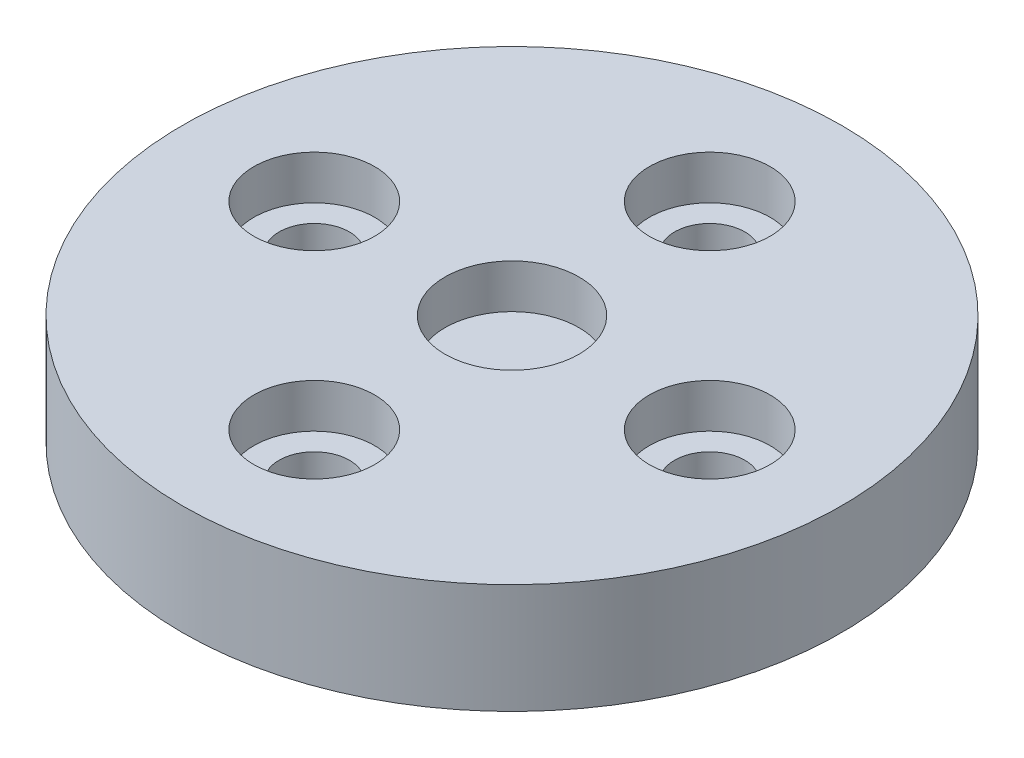
ISO-10303-21;
HEADER;
FILE_DESCRIPTION(('STEP AP214'),'2;1');
FILE_NAME('part.step','',(''),(''),'','','');
FILE_SCHEMA(('AUTOMOTIVE_DESIGN { 1 0 10303 214 1 1 1 1 }'));
ENDSEC;
DATA;
#1=APPLICATION_CONTEXT('core data for automotive mechanical design processes');
#2=APPLICATION_PROTOCOL_DEFINITION('international standard','automotive_design',2000,#1);
#3=PRODUCT_CONTEXT('',#1,'mechanical');
#4=PRODUCT('Part','Part','',(#3));
#5=PRODUCT_RELATED_PRODUCT_CATEGORY('part','',(#4));
#6=PRODUCT_DEFINITION_FORMATION('','',#4);
#7=PRODUCT_DEFINITION_CONTEXT('part definition',#1,'design');
#8=PRODUCT_DEFINITION('design','',#6,#7);
#9=PRODUCT_DEFINITION_SHAPE('','',#8);
#10=(LENGTH_UNIT() NAMED_UNIT(*) SI_UNIT(.MILLI.,.METRE.));
#11=(NAMED_UNIT(*) PLANE_ANGLE_UNIT() SI_UNIT($,.RADIAN.));
#12=(NAMED_UNIT(*) SI_UNIT($,.STERADIAN.) SOLID_ANGLE_UNIT());
#13=UNCERTAINTY_MEASURE_WITH_UNIT(LENGTH_MEASURE(1.E-05),#10,'distance_accuracy_value','');
#14=(GEOMETRIC_REPRESENTATION_CONTEXT(3) GLOBAL_UNCERTAINTY_ASSIGNED_CONTEXT((#13)) GLOBAL_UNIT_ASSIGNED_CONTEXT((#10,
#11,#12)) REPRESENTATION_CONTEXT('',''));
#15=CARTESIAN_POINT('',(0.,0.,0.));
#16=DIRECTION('',(0.,0.,1.));
#17=DIRECTION('',(1.,0.,0.));
#18=AXIS2_PLACEMENT_3D('',#15,#16,#17);
#19=CARTESIAN_POINT('',(-9.,-4.52548339959391,0.));
#20=DIRECTION('',(0.,1.,0.));
#21=DIRECTION('',(0.,0.,1.));
#22=AXIS2_PLACEMENT_3D('',#19,#20,#21);
#23=CYLINDRICAL_SURFACE('',#22,1.6);
#24=CARTESIAN_POINT('',(-9.,0.,0.));
#25=DIRECTION('',(0.,1.,0.));
#26=DIRECTION('',(0.,0.,1.));
#27=AXIS2_PLACEMENT_3D('',#24,#25,#26);
#28=CIRCLE('',#27,1.6);
#29=CARTESIAN_POINT('',(-9.,0.,1.59999999999996));
#30=VERTEX_POINT('',#29);
#31=EDGE_CURVE('E61',#30,#30,#28,.F.);
#32=ORIENTED_EDGE('',*,*,#31,.T.);
#33=EDGE_LOOP('',(#32));
#34=FACE_BOUND('',#33,.T.);
#35=CARTESIAN_POINT('',(-9.,3.,0.));
#36=DIRECTION('',(0.,1.,0.));
#37=DIRECTION('',(0.,0.,1.));
#38=AXIS2_PLACEMENT_3D('',#35,#36,#37);
#39=CIRCLE('',#38,1.6);
#40=CARTESIAN_POINT('',(-9.,3.,1.59999999999996));
#41=VERTEX_POINT('',#40);
#42=EDGE_CURVE('E35',#41,#41,#39,.F.);
#43=ORIENTED_EDGE('',*,*,#42,.F.);
#44=EDGE_LOOP('',(#43));
#45=FACE_BOUND('',#44,.T.);
#46=ADVANCED_FACE('F31',(#34,#45),#23,.F.);
#47=CARTESIAN_POINT('',(9.,-4.52548339959391,0.));
#48=DIRECTION('',(0.,1.,0.));
#49=DIRECTION('',(0.,0.,1.));
#50=AXIS2_PLACEMENT_3D('',#47,#48,#49);
#51=CYLINDRICAL_SURFACE('',#50,1.6);
#52=CARTESIAN_POINT('',(9.,0.,0.));
#53=DIRECTION('',(0.,1.,0.));
#54=DIRECTION('',(0.,0.,1.));
#55=AXIS2_PLACEMENT_3D('',#52,#53,#54);
#56=CIRCLE('',#55,1.6);
#57=CARTESIAN_POINT('',(9.,0.,1.59999999999996));
#58=VERTEX_POINT('',#57);
#59=EDGE_CURVE('E65',#58,#58,#56,.F.);
#60=ORIENTED_EDGE('',*,*,#59,.T.);
#61=EDGE_LOOP('',(#60));
#62=FACE_BOUND('',#61,.T.);
#63=CARTESIAN_POINT('',(9.,3.,0.));
#64=DIRECTION('',(0.,1.,0.));
#65=DIRECTION('',(0.,0.,1.));
#66=AXIS2_PLACEMENT_3D('',#63,#64,#65);
#67=CIRCLE('',#66,1.6);
#68=CARTESIAN_POINT('',(9.,3.,1.59999999999996));
#69=VERTEX_POINT('',#68);
#70=EDGE_CURVE('E56',#69,#69,#67,.F.);
#71=ORIENTED_EDGE('',*,*,#70,.F.);
#72=EDGE_LOOP('',(#71));
#73=FACE_BOUND('',#72,.T.);
#74=ADVANCED_FACE('F158',(#62,#73),#51,.F.);
#75=CARTESIAN_POINT('',(0.,-4.52548339959391,9.));
#76=DIRECTION('',(0.,1.,0.));
#77=DIRECTION('',(0.,0.,1.));
#78=AXIS2_PLACEMENT_3D('',#75,#76,#77);
#79=CYLINDRICAL_SURFACE('',#78,1.6);
#80=CARTESIAN_POINT('',(0.,0.,9.));
#81=DIRECTION('',(0.,1.,0.));
#82=DIRECTION('',(0.,0.,1.));
#83=AXIS2_PLACEMENT_3D('',#80,#81,#82);
#84=CIRCLE('',#83,1.6);
#85=CARTESIAN_POINT('',(0.,0.,10.6));
#86=VERTEX_POINT('',#85);
#87=EDGE_CURVE('E70',#86,#86,#84,.F.);
#88=ORIENTED_EDGE('',*,*,#87,.T.);
#89=EDGE_LOOP('',(#88));
#90=FACE_BOUND('',#89,.T.);
#91=CARTESIAN_POINT('',(0.,3.,9.));
#92=DIRECTION('',(0.,1.,0.));
#93=DIRECTION('',(0.,0.,1.));
#94=AXIS2_PLACEMENT_3D('',#91,#92,#93);
#95=CIRCLE('',#94,1.6);
#96=CARTESIAN_POINT('',(0.,3.,10.6));
#97=VERTEX_POINT('',#96);
#98=EDGE_CURVE('E53',#97,#97,#95,.F.);
#99=ORIENTED_EDGE('',*,*,#98,.F.);
#100=EDGE_LOOP('',(#99));
#101=FACE_BOUND('',#100,.T.);
#102=ADVANCED_FACE('F163',(#90,#101),#79,.F.);
#103=CARTESIAN_POINT('',(0.,-4.52548339959391,-9.));
#104=DIRECTION('',(0.,1.,0.));
#105=DIRECTION('',(0.,0.,1.));
#106=AXIS2_PLACEMENT_3D('',#103,#104,#105);
#107=CYLINDRICAL_SURFACE('',#106,1.6);
#108=CARTESIAN_POINT('',(0.,0.,-9.));
#109=DIRECTION('',(0.,1.,0.));
#110=DIRECTION('',(0.,0.,1.));
#111=AXIS2_PLACEMENT_3D('',#108,#109,#110);
#112=CIRCLE('',#111,1.6);
#113=CARTESIAN_POINT('',(0.,0.,-7.4));
#114=VERTEX_POINT('',#113);
#115=EDGE_CURVE('E77',#114,#114,#112,.F.);
#116=ORIENTED_EDGE('',*,*,#115,.T.);
#117=EDGE_LOOP('',(#116));
#118=FACE_BOUND('',#117,.T.);
#119=CARTESIAN_POINT('',(0.,3.,-9.));
#120=DIRECTION('',(0.,1.,0.));
#121=DIRECTION('',(0.,0.,1.));
#122=AXIS2_PLACEMENT_3D('',#119,#120,#121);
#123=CIRCLE('',#122,1.6);
#124=CARTESIAN_POINT('',(0.,3.,-7.4));
#125=VERTEX_POINT('',#124);
#126=EDGE_CURVE('E50',#125,#125,#123,.F.);
#127=ORIENTED_EDGE('',*,*,#126,.F.);
#128=EDGE_LOOP('',(#127));
#129=FACE_BOUND('',#128,.T.);
#130=ADVANCED_FACE('F189',(#118,#129),#107,.F.);
#131=CARTESIAN_POINT('',(0.,5.,0.));
#132=DIRECTION('',(0.,-1.,0.));
#133=DIRECTION('',(0.,0.,-1.));
#134=AXIS2_PLACEMENT_3D('',#131,#132,#133);
#135=CYLINDRICAL_SURFACE('',#134,15.);
#136=CARTESIAN_POINT('',(0.,5.,0.));
#137=DIRECTION('',(0.,1.,0.));
#138=DIRECTION('',(0.,0.,1.));
#139=AXIS2_PLACEMENT_3D('',#136,#137,#138);
#140=CIRCLE('',#139,15.);
#141=CARTESIAN_POINT('',(0.,5.,15.));
#142=VERTEX_POINT('',#141);
#143=EDGE_CURVE('E10',#142,#142,#140,.T.);
#144=ORIENTED_EDGE('',*,*,#143,.F.);
#145=EDGE_LOOP('',(#144));
#146=FACE_BOUND('',#145,.T.);
#147=CARTESIAN_POINT('',(0.,0.,0.));
#148=DIRECTION('',(0.,1.,0.));
#149=DIRECTION('',(0.,0.,1.));
#150=AXIS2_PLACEMENT_3D('',#147,#148,#149);
#151=CIRCLE('',#150,15.);
#152=CARTESIAN_POINT('',(0.,0.,15.));
#153=VERTEX_POINT('',#152);
#154=EDGE_CURVE('E39',#153,#153,#151,.T.);
#155=ORIENTED_EDGE('',*,*,#154,.T.);
#156=EDGE_LOOP('',(#155));
#157=FACE_BOUND('',#156,.T.);
#158=ADVANCED_FACE('F33',(#146,#157),#135,.T.);
#159=CARTESIAN_POINT('',(0.,5.,0.));
#160=DIRECTION('',(0.,1.,0.));
#161=DIRECTION('',(0.,0.,1.));
#162=AXIS2_PLACEMENT_3D('',#159,#160,#161);
#163=PLANE('',#162);
#164=CARTESIAN_POINT('',(0.,5.,-9.));
#165=DIRECTION('',(0.,1.,0.));
#166=DIRECTION('',(0.,0.,1.));
#167=AXIS2_PLACEMENT_3D('',#164,#165,#166);
#168=CIRCLE('',#167,2.75);
#169=CARTESIAN_POINT('',(0.,5.,-6.25));
#170=VERTEX_POINT('',#169);
#171=EDGE_CURVE('E99',#170,#170,#168,.T.);
#172=ORIENTED_EDGE('',*,*,#171,.F.);
#173=EDGE_LOOP('',(#172));
#174=FACE_BOUND('',#173,.T.);
#175=CARTESIAN_POINT('',(0.,5.,0.));
#176=DIRECTION('',(0.,1.,0.));
#177=DIRECTION('',(0.,0.,1.));
#178=AXIS2_PLACEMENT_3D('',#175,#176,#177);
#179=CIRCLE('',#178,3.05);
#180=CARTESIAN_POINT('',(0.,5.,3.05));
#181=VERTEX_POINT('',#180);
#182=EDGE_CURVE('E100',#181,#181,#179,.T.);
#183=ORIENTED_EDGE('',*,*,#182,.F.);
#184=EDGE_LOOP('',(#183));
#185=FACE_BOUND('',#184,.T.);
#186=CARTESIAN_POINT('',(0.,5.,9.));
#187=DIRECTION('',(0.,1.,0.));
#188=DIRECTION('',(0.,0.,1.));
#189=AXIS2_PLACEMENT_3D('',#186,#187,#188);
#190=CIRCLE('',#189,2.75);
#191=CARTESIAN_POINT('',(0.,5.,11.75));
#192=VERTEX_POINT('',#191);
#193=EDGE_CURVE('E106',#192,#192,#190,.T.);
#194=ORIENTED_EDGE('',*,*,#193,.F.);
#195=EDGE_LOOP('',(#194));
#196=FACE_BOUND('',#195,.T.);
#197=CARTESIAN_POINT('',(9.,5.,0.));
#198=DIRECTION('',(0.,1.,0.));
#199=DIRECTION('',(0.,0.,1.));
#200=AXIS2_PLACEMENT_3D('',#197,#198,#199);
#201=CIRCLE('',#200,2.75);
#202=CARTESIAN_POINT('',(9.,5.,2.74999999999996));
#203=VERTEX_POINT('',#202);
#204=EDGE_CURVE('E86',#203,#203,#201,.T.);
#205=ORIENTED_EDGE('',*,*,#204,.F.);
#206=EDGE_LOOP('',(#205));
#207=FACE_BOUND('',#206,.T.);
#208=CARTESIAN_POINT('',(-9.,5.,0.));
#209=DIRECTION('',(0.,1.,0.));
#210=DIRECTION('',(0.,0.,1.));
#211=AXIS2_PLACEMENT_3D('',#208,#209,#210);
#212=CIRCLE('',#211,2.75);
#213=CARTESIAN_POINT('',(-9.,5.,2.74999999999996));
#214=VERTEX_POINT('',#213);
#215=EDGE_CURVE('E93',#214,#214,#212,.T.);
#216=ORIENTED_EDGE('',*,*,#215,.F.);
#217=EDGE_LOOP('',(#216));
#218=FACE_BOUND('',#217,.T.);
#219=ORIENTED_EDGE('',*,*,#143,.T.);
#220=EDGE_LOOP('',(#219));
#221=FACE_BOUND('',#220,.T.);
#222=ADVANCED_FACE('F126',(#174,#185,#196,#207,#218,#221),#163,.T.);
#223=CARTESIAN_POINT('',(0.,0.,0.));
#224=DIRECTION('',(0.,1.,0.));
#225=DIRECTION('',(0.,0.,1.));
#226=AXIS2_PLACEMENT_3D('',#223,#224,#225);
#227=PLANE('',#226);
#228=ORIENTED_EDGE('',*,*,#115,.F.);
#229=EDGE_LOOP('',(#228));
#230=FACE_BOUND('',#229,.T.);
#231=ORIENTED_EDGE('',*,*,#87,.F.);
#232=EDGE_LOOP('',(#231));
#233=FACE_BOUND('',#232,.T.);
#234=ORIENTED_EDGE('',*,*,#59,.F.);
#235=EDGE_LOOP('',(#234));
#236=FACE_BOUND('',#235,.T.);
#237=ORIENTED_EDGE('',*,*,#31,.F.);
#238=EDGE_LOOP('',(#237));
#239=FACE_BOUND('',#238,.T.);
#240=CARTESIAN_POINT('',(0.,0.,0.));
#241=DIRECTION('',(0.,-1.,0.));
#242=DIRECTION('',(0.,0.,-1.));
#243=AXIS2_PLACEMENT_3D('',#240,#241,#242);
#244=CIRCLE('',#243,3.);
#245=CARTESIAN_POINT('',(0.,0.,-3.));
#246=VERTEX_POINT('',#245);
#247=EDGE_CURVE('E47',#246,#246,#244,.T.);
#248=ORIENTED_EDGE('',*,*,#247,.F.);
#249=EDGE_LOOP('',(#248));
#250=FACE_BOUND('',#249,.T.);
#251=ORIENTED_EDGE('',*,*,#154,.F.);
#252=EDGE_LOOP('',(#251));
#253=FACE_BOUND('',#252,.T.);
#254=ADVANCED_FACE('F129',(#230,#233,#236,#239,#250,#253),#227,.F.);
#255=CARTESIAN_POINT('',(0.,2.,0.));
#256=DIRECTION('',(0.,-1.,0.));
#257=DIRECTION('',(0.,0.,-1.));
#258=AXIS2_PLACEMENT_3D('',#255,#256,#257);
#259=CYLINDRICAL_SURFACE('',#258,3.);
#260=CARTESIAN_POINT('',(0.,2.,0.));
#261=DIRECTION('',(0.,-1.,0.));
#262=DIRECTION('',(0.,0.,-1.));
#263=AXIS2_PLACEMENT_3D('',#260,#261,#262);
#264=CIRCLE('',#263,3.);
#265=CARTESIAN_POINT('',(0.,2.,-3.));
#266=VERTEX_POINT('',#265);
#267=EDGE_CURVE('E44',#266,#266,#264,.T.);
#268=ORIENTED_EDGE('',*,*,#267,.F.);
#269=EDGE_LOOP('',(#268));
#270=FACE_BOUND('',#269,.T.);
#271=ORIENTED_EDGE('',*,*,#247,.T.);
#272=EDGE_LOOP('',(#271));
#273=FACE_BOUND('',#272,.T.);
#274=ADVANCED_FACE('F172',(#270,#273),#259,.F.);
#275=CARTESIAN_POINT('',(0.,2.,0.));
#276=DIRECTION('',(0.,-1.,0.));
#277=DIRECTION('',(0.,0.,-1.));
#278=AXIS2_PLACEMENT_3D('',#275,#276,#277);
#279=PLANE('',#278);
#280=ORIENTED_EDGE('',*,*,#267,.T.);
#281=EDGE_LOOP('',(#280));
#282=FACE_BOUND('',#281,.T.);
#283=ADVANCED_FACE('F169',(#282),#279,.T.);
#284=CARTESIAN_POINT('',(0.,3.,-9.));
#285=DIRECTION('',(0.,1.,0.));
#286=DIRECTION('',(0.,0.,1.));
#287=AXIS2_PLACEMENT_3D('',#284,#285,#286);
#288=PLANE('',#287);
#289=CARTESIAN_POINT('',(0.,3.,-9.));
#290=DIRECTION('',(0.,1.,0.));
#291=DIRECTION('',(0.,0.,1.));
#292=AXIS2_PLACEMENT_3D('',#289,#290,#291);
#293=CIRCLE('',#292,2.75);
#294=CARTESIAN_POINT('',(0.,3.,-6.25));
#295=VERTEX_POINT('',#294);
#296=EDGE_CURVE('E54',#295,#295,#293,.T.);
#297=ORIENTED_EDGE('',*,*,#296,.T.);
#298=EDGE_LOOP('',(#297));
#299=FACE_BOUND('',#298,.T.);
#300=ORIENTED_EDGE('',*,*,#126,.T.);
#301=EDGE_LOOP('',(#300));
#302=FACE_BOUND('',#301,.T.);
#303=ADVANCED_FACE('F116',(#299,#302),#288,.T.);
#304=CARTESIAN_POINT('',(0.,3.,-9.));
#305=DIRECTION('',(0.,1.,0.));
#306=DIRECTION('',(0.,0.,1.));
#307=AXIS2_PLACEMENT_3D('',#304,#305,#306);
#308=CYLINDRICAL_SURFACE('',#307,2.75);
#309=ORIENTED_EDGE('',*,*,#296,.F.);
#310=EDGE_LOOP('',(#309));
#311=FACE_BOUND('',#310,.T.);
#312=ORIENTED_EDGE('',*,*,#171,.T.);
#313=EDGE_LOOP('',(#312));
#314=FACE_BOUND('',#313,.T.);
#315=ADVANCED_FACE('F119',(#311,#314),#308,.F.);
#316=CARTESIAN_POINT('',(0.,3.,9.));
#317=DIRECTION('',(0.,1.,0.));
#318=DIRECTION('',(0.,0.,1.));
#319=AXIS2_PLACEMENT_3D('',#316,#317,#318);
#320=PLANE('',#319);
#321=CARTESIAN_POINT('',(0.,3.,9.));
#322=DIRECTION('',(0.,1.,0.));
#323=DIRECTION('',(0.,0.,1.));
#324=AXIS2_PLACEMENT_3D('',#321,#322,#323);
#325=CIRCLE('',#324,2.75);
#326=CARTESIAN_POINT('',(0.,3.,11.75));
#327=VERTEX_POINT('',#326);
#328=EDGE_CURVE('E90',#327,#327,#325,.T.);
#329=ORIENTED_EDGE('',*,*,#328,.T.);
#330=EDGE_LOOP('',(#329));
#331=FACE_BOUND('',#330,.T.);
#332=ORIENTED_EDGE('',*,*,#98,.T.);
#333=EDGE_LOOP('',(#332));
#334=FACE_BOUND('',#333,.T.);
#335=ADVANCED_FACE('F122',(#331,#334),#320,.T.);
#336=CARTESIAN_POINT('',(0.,3.,9.));
#337=DIRECTION('',(0.,1.,0.));
#338=DIRECTION('',(0.,0.,1.));
#339=AXIS2_PLACEMENT_3D('',#336,#337,#338);
#340=CYLINDRICAL_SURFACE('',#339,2.75);
#341=ORIENTED_EDGE('',*,*,#328,.F.);
#342=EDGE_LOOP('',(#341));
#343=FACE_BOUND('',#342,.T.);
#344=ORIENTED_EDGE('',*,*,#193,.T.);
#345=EDGE_LOOP('',(#344));
#346=FACE_BOUND('',#345,.T.);
#347=ADVANCED_FACE('F205',(#343,#346),#340,.F.);
#348=CARTESIAN_POINT('',(9.,3.,0.));
#349=DIRECTION('',(0.,1.,0.));
#350=DIRECTION('',(0.,0.,1.));
#351=AXIS2_PLACEMENT_3D('',#348,#349,#350);
#352=PLANE('',#351);
#353=CARTESIAN_POINT('',(9.,3.,0.));
#354=DIRECTION('',(0.,1.,0.));
#355=DIRECTION('',(0.,0.,1.));
#356=AXIS2_PLACEMENT_3D('',#353,#354,#355);
#357=CIRCLE('',#356,2.75);
#358=CARTESIAN_POINT('',(9.,3.,2.74999999999996));
#359=VERTEX_POINT('',#358);
#360=EDGE_CURVE('E89',#359,#359,#357,.T.);
#361=ORIENTED_EDGE('',*,*,#360,.T.);
#362=EDGE_LOOP('',(#361));
#363=FACE_BOUND('',#362,.T.);
#364=ORIENTED_EDGE('',*,*,#70,.T.);
#365=EDGE_LOOP('',(#364));
#366=FACE_BOUND('',#365,.T.);
#367=ADVANCED_FACE('F202',(#363,#366),#352,.T.);
#368=CARTESIAN_POINT('',(9.,3.,0.));
#369=DIRECTION('',(0.,1.,0.));
#370=DIRECTION('',(0.,0.,1.));
#371=AXIS2_PLACEMENT_3D('',#368,#369,#370);
#372=CYLINDRICAL_SURFACE('',#371,2.75);
#373=ORIENTED_EDGE('',*,*,#360,.F.);
#374=EDGE_LOOP('',(#373));
#375=FACE_BOUND('',#374,.T.);
#376=ORIENTED_EDGE('',*,*,#204,.T.);
#377=EDGE_LOOP('',(#376));
#378=FACE_BOUND('',#377,.T.);
#379=ADVANCED_FACE('F152',(#375,#378),#372,.F.);
#380=CARTESIAN_POINT('',(-9.,3.,0.));
#381=DIRECTION('',(0.,1.,0.));
#382=DIRECTION('',(0.,0.,1.));
#383=AXIS2_PLACEMENT_3D('',#380,#381,#382);
#384=PLANE('',#383);
#385=CARTESIAN_POINT('',(-9.,3.,0.));
#386=DIRECTION('',(0.,1.,0.));
#387=DIRECTION('',(0.,0.,1.));
#388=AXIS2_PLACEMENT_3D('',#385,#386,#387);
#389=CIRCLE('',#388,2.75);
#390=CARTESIAN_POINT('',(-9.,3.,2.74999999999996));
#391=VERTEX_POINT('',#390);
#392=EDGE_CURVE('E96',#391,#391,#389,.T.);
#393=ORIENTED_EDGE('',*,*,#392,.T.);
#394=EDGE_LOOP('',(#393));
#395=FACE_BOUND('',#394,.T.);
#396=ORIENTED_EDGE('',*,*,#42,.T.);
#397=EDGE_LOOP('',(#396));
#398=FACE_BOUND('',#397,.T.);
#399=ADVANCED_FACE('F142',(#395,#398),#384,.T.);
#400=CARTESIAN_POINT('',(-9.,3.,0.));
#401=DIRECTION('',(0.,1.,0.));
#402=DIRECTION('',(0.,0.,1.));
#403=AXIS2_PLACEMENT_3D('',#400,#401,#402);
#404=CYLINDRICAL_SURFACE('',#403,2.75);
#405=ORIENTED_EDGE('',*,*,#392,.F.);
#406=EDGE_LOOP('',(#405));
#407=FACE_BOUND('',#406,.T.);
#408=ORIENTED_EDGE('',*,*,#215,.T.);
#409=EDGE_LOOP('',(#408));
#410=FACE_BOUND('',#409,.T.);
#411=ADVANCED_FACE('F139',(#407,#410),#404,.F.);
#412=CARTESIAN_POINT('',(0.,3.,0.));
#413=DIRECTION('',(0.,1.,0.));
#414=DIRECTION('',(0.,0.,1.));
#415=AXIS2_PLACEMENT_3D('',#412,#413,#414);
#416=CYLINDRICAL_SURFACE('',#415,3.05);
#417=CARTESIAN_POINT('',(0.,3.,0.));
#418=DIRECTION('',(0.,1.,0.));
#419=DIRECTION('',(0.,0.,1.));
#420=AXIS2_PLACEMENT_3D('',#417,#418,#419);
#421=CIRCLE('',#420,3.05);
#422=CARTESIAN_POINT('',(0.,3.,3.05));
#423=VERTEX_POINT('',#422);
#424=EDGE_CURVE('E103',#423,#423,#421,.T.);
#425=ORIENTED_EDGE('',*,*,#424,.F.);
#426=EDGE_LOOP('',(#425));
#427=FACE_BOUND('',#426,.T.);
#428=ORIENTED_EDGE('',*,*,#182,.T.);
#429=EDGE_LOOP('',(#428));
#430=FACE_BOUND('',#429,.T.);
#431=ADVANCED_FACE('F141',(#427,#430),#416,.F.);
#432=CARTESIAN_POINT('',(0.,3.,0.));
#433=DIRECTION('',(0.,1.,0.));
#434=DIRECTION('',(0.,0.,1.));
#435=AXIS2_PLACEMENT_3D('',#432,#433,#434);
#436=PLANE('',#435);
#437=ORIENTED_EDGE('',*,*,#424,.T.);
#438=EDGE_LOOP('',(#437));
#439=FACE_BOUND('',#438,.T.);
#440=ADVANCED_FACE('F149',(#439),#436,.T.);
#441=CLOSED_SHELL('',(#46,#74,#102,#130,#158,#222,#254,#274,#283,#303,#315,#335,#347,#367,#379,
#399,#411,#431,#440));
#442=MANIFOLD_SOLID_BREP('B2',#441);
#443=ADVANCED_BREP_SHAPE_REPRESENTATION('',(#18,#442),#14);
#444=SHAPE_DEFINITION_REPRESENTATION(#9,#443);
ENDSEC;
END-ISO-10303-21;
